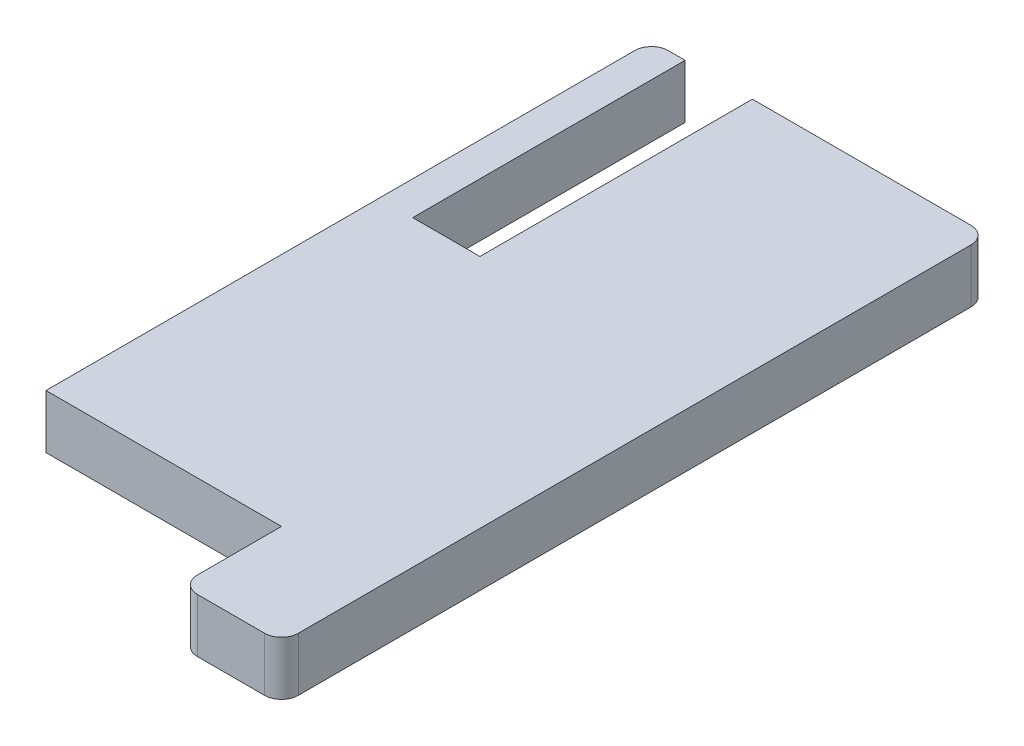
ISO-10303-21;
HEADER;
FILE_DESCRIPTION(('STEP AP214'),'2;1');
FILE_NAME('part.step','',(''),(''),'','','');
FILE_SCHEMA(('AUTOMOTIVE_DESIGN { 1 0 10303 214 1 1 1 1 }'));
ENDSEC;
DATA;
#1=APPLICATION_CONTEXT('core data for automotive mechanical design processes');
#2=APPLICATION_PROTOCOL_DEFINITION('international standard','automotive_design',2000,#1);
#3=PRODUCT_CONTEXT('',#1,'mechanical');
#4=PRODUCT('Part','Part','',(#3));
#5=PRODUCT_RELATED_PRODUCT_CATEGORY('part','',(#4));
#6=PRODUCT_DEFINITION_FORMATION('','',#4);
#7=PRODUCT_DEFINITION_CONTEXT('part definition',#1,'design');
#8=PRODUCT_DEFINITION('design','',#6,#7);
#9=PRODUCT_DEFINITION_SHAPE('','',#8);
#10=(LENGTH_UNIT() NAMED_UNIT(*) SI_UNIT(.MILLI.,.METRE.));
#11=(NAMED_UNIT(*) PLANE_ANGLE_UNIT() SI_UNIT($,.RADIAN.));
#12=(NAMED_UNIT(*) SI_UNIT($,.STERADIAN.) SOLID_ANGLE_UNIT());
#13=UNCERTAINTY_MEASURE_WITH_UNIT(LENGTH_MEASURE(1.E-05),#10,'distance_accuracy_value','');
#14=(GEOMETRIC_REPRESENTATION_CONTEXT(3) GLOBAL_UNCERTAINTY_ASSIGNED_CONTEXT((#13)) GLOBAL_UNIT_ASSIGNED_CONTEXT((#10,
#11,#12)) REPRESENTATION_CONTEXT('',''));
#15=CARTESIAN_POINT('',(0.,0.,0.));
#16=DIRECTION('',(0.,0.,1.));
#17=DIRECTION('',(1.,0.,0.));
#18=AXIS2_PLACEMENT_3D('',#15,#16,#17);
#19=CARTESIAN_POINT('',(623.012021769865,1.6,60.9484135564208));
#20=DIRECTION('',(0.,-1.,0.));
#21=DIRECTION('',(0.,0.,-1.));
#22=AXIS2_PLACEMENT_3D('',#19,#20,#21);
#23=CYLINDRICAL_SURFACE('',#22,0.500000000000028);
#24=CARTESIAN_POINT('',(623.012021769865,0.,60.9484135564208));
#25=DIRECTION('',(0.,1.,0.));
#26=DIRECTION('',(0.,0.,1.));
#27=AXIS2_PLACEMENT_3D('',#24,#25,#26);
#28=CIRCLE('',#27,0.500000000000028);
#29=CARTESIAN_POINT('',(622.512021769865,0.,60.9484135564208));
#30=VERTEX_POINT('',#29);
#31=CARTESIAN_POINT('',(623.012021769865,0.,61.4484135564208));
#32=VERTEX_POINT('',#31);
#33=EDGE_CURVE('E176',#30,#32,#28,.T.);
#34=ORIENTED_EDGE('',*,*,#33,.T.);
#35=DIRECTION('',(0.,-1.,0.));
#36=VECTOR('',#35,1.);
#37=CARTESIAN_POINT('',(623.012021769865,1.6,61.4484135564208));
#38=LINE('',#37,#36);
#39=CARTESIAN_POINT('',(623.012021769865,1.6,61.4484135564208));
#40=VERTEX_POINT('',#39);
#41=EDGE_CURVE('E11',#40,#32,#38,.T.);
#42=ORIENTED_EDGE('',*,*,#41,.F.);
#43=CARTESIAN_POINT('',(623.012021769865,1.6,60.9484135564208));
#44=DIRECTION('',(0.,1.,0.));
#45=DIRECTION('',(0.,0.,1.));
#46=AXIS2_PLACEMENT_3D('',#43,#44,#45);
#47=CIRCLE('',#46,0.500000000000028);
#48=CARTESIAN_POINT('',(622.512021769865,1.6,60.9484135564208));
#49=VERTEX_POINT('',#48);
#50=EDGE_CURVE('E218',#49,#40,#47,.T.);
#51=ORIENTED_EDGE('',*,*,#50,.F.);
#52=DIRECTION('',(0.,-1.,0.));
#53=VECTOR('',#52,1.);
#54=CARTESIAN_POINT('',(622.512021769865,1.6,60.9484135564208));
#55=LINE('',#54,#53);
#56=EDGE_CURVE('E172',#49,#30,#55,.T.);
#57=ORIENTED_EDGE('',*,*,#56,.T.);
#58=EDGE_LOOP('',(#34,#42,#51,#57));
#59=FACE_BOUND('',#58,.T.);
#60=ADVANCED_FACE('F39',(#59),#23,.T.);
#61=CARTESIAN_POINT('',(623.012021769865,1.6,61.4484135564208));
#62=DIRECTION('',(0.,0.,-1.));
#63=DIRECTION('',(-1.,0.,0.));
#64=AXIS2_PLACEMENT_3D('',#61,#62,#63);
#65=PLANE('',#64);
#66=DIRECTION('',(1.,0.,0.));
#67=VECTOR('',#66,1.);
#68=CARTESIAN_POINT('',(623.012021769865,0.,61.4484135564208));
#69=LINE('',#68,#67);
#70=CARTESIAN_POINT('',(625.012021769865,0.,61.4484135564208));
#71=VERTEX_POINT('',#70);
#72=EDGE_CURVE('E180',#32,#71,#69,.T.);
#73=ORIENTED_EDGE('',*,*,#72,.T.);
#74=DIRECTION('',(0.,-1.,0.));
#75=VECTOR('',#74,1.);
#76=CARTESIAN_POINT('',(625.012021769865,1.6,61.4484135564208));
#77=LINE('',#76,#75);
#78=CARTESIAN_POINT('',(625.012021769865,1.6,61.4484135564208));
#79=VERTEX_POINT('',#78);
#80=EDGE_CURVE('E48',#79,#71,#77,.T.);
#81=ORIENTED_EDGE('',*,*,#80,.F.);
#82=DIRECTION('',(1.,0.,0.));
#83=VECTOR('',#82,1.);
#84=CARTESIAN_POINT('',(623.012021769865,1.6,61.4484135564208));
#85=LINE('',#84,#83);
#86=EDGE_CURVE('E116',#40,#79,#85,.T.);
#87=ORIENTED_EDGE('',*,*,#86,.F.);
#88=ORIENTED_EDGE('',*,*,#41,.T.);
#89=EDGE_LOOP('',(#73,#81,#87,#88));
#90=FACE_BOUND('',#89,.T.);
#91=ADVANCED_FACE('F324',(#90),#65,.F.);
#92=CARTESIAN_POINT('',(625.012021769865,1.6,60.9484135564208));
#93=DIRECTION('',(0.,-1.,0.));
#94=DIRECTION('',(0.,0.,-1.));
#95=AXIS2_PLACEMENT_3D('',#92,#93,#94);
#96=CYLINDRICAL_SURFACE('',#95,0.499999999999973);
#97=CARTESIAN_POINT('',(625.012021769865,0.,60.9484135564208));
#98=DIRECTION('',(0.,1.,0.));
#99=DIRECTION('',(0.,0.,1.));
#100=AXIS2_PLACEMENT_3D('',#97,#98,#99);
#101=CIRCLE('',#100,0.499999999999973);
#102=CARTESIAN_POINT('',(625.512021769865,0.,60.9484135564208));
#103=VERTEX_POINT('',#102);
#104=EDGE_CURVE('E183',#71,#103,#101,.T.);
#105=ORIENTED_EDGE('',*,*,#104,.T.);
#106=DIRECTION('',(0.,-1.,0.));
#107=VECTOR('',#106,1.);
#108=CARTESIAN_POINT('',(625.512021769865,1.6,60.9484135564208));
#109=LINE('',#108,#107);
#110=CARTESIAN_POINT('',(625.512021769865,1.6,60.9484135564208));
#111=VERTEX_POINT('',#110);
#112=EDGE_CURVE('E253',#111,#103,#109,.T.);
#113=ORIENTED_EDGE('',*,*,#112,.F.);
#114=CARTESIAN_POINT('',(625.012021769865,1.6,60.9484135564208));
#115=DIRECTION('',(0.,1.,0.));
#116=DIRECTION('',(0.,0.,1.));
#117=AXIS2_PLACEMENT_3D('',#114,#115,#116);
#118=CIRCLE('',#117,0.499999999999973);
#119=EDGE_CURVE('E263',#79,#111,#118,.T.);
#120=ORIENTED_EDGE('',*,*,#119,.F.);
#121=ORIENTED_EDGE('',*,*,#80,.T.);
#122=EDGE_LOOP('',(#105,#113,#120,#121));
#123=FACE_BOUND('',#122,.T.);
#124=ADVANCED_FACE('F261',(#123),#96,.T.);
#125=CARTESIAN_POINT('',(625.512021769865,1.6,60.9484135564208));
#126=DIRECTION('',(-1.,0.,0.));
#127=DIRECTION('',(0.,0.,1.));
#128=AXIS2_PLACEMENT_3D('',#125,#126,#127);
#129=PLANE('',#128);
#130=DIRECTION('',(0.,0.,-1.));
#131=VECTOR('',#130,1.);
#132=CARTESIAN_POINT('',(625.512021769865,0.,60.9484135564208));
#133=LINE('',#132,#131);
#134=CARTESIAN_POINT('',(625.512021769865,0.,40.9484135564208));
#135=VERTEX_POINT('',#134);
#136=EDGE_CURVE('E186',#103,#135,#133,.T.);
#137=ORIENTED_EDGE('',*,*,#136,.T.);
#138=DIRECTION('',(0.,-1.,0.));
#139=VECTOR('',#138,1.);
#140=CARTESIAN_POINT('',(625.512021769865,1.6,40.9484135564208));
#141=LINE('',#140,#139);
#142=CARTESIAN_POINT('',(625.512021769865,1.6,40.9484135564208));
#143=VERTEX_POINT('',#142);
#144=EDGE_CURVE('E249',#143,#135,#141,.T.);
#145=ORIENTED_EDGE('',*,*,#144,.F.);
#146=DIRECTION('',(0.,0.,-1.));
#147=VECTOR('',#146,1.);
#148=CARTESIAN_POINT('',(625.512021769865,1.6,60.9484135564208));
#149=LINE('',#148,#147);
#150=EDGE_CURVE('E281',#111,#143,#149,.T.);
#151=ORIENTED_EDGE('',*,*,#150,.F.);
#152=ORIENTED_EDGE('',*,*,#112,.T.);
#153=EDGE_LOOP('',(#137,#145,#151,#152));
#154=FACE_BOUND('',#153,.T.);
#155=ADVANCED_FACE('F271',(#154),#129,.F.);
#156=CARTESIAN_POINT('',(625.012021769865,1.6,40.9484135564208));
#157=DIRECTION('',(0.,-1.,0.));
#158=DIRECTION('',(0.,0.,-1.));
#159=AXIS2_PLACEMENT_3D('',#156,#157,#158);
#160=CYLINDRICAL_SURFACE('',#159,0.499999999999973);
#161=CARTESIAN_POINT('',(625.012021769865,0.,40.9484135564208));
#162=DIRECTION('',(0.,1.,0.));
#163=DIRECTION('',(0.,0.,1.));
#164=AXIS2_PLACEMENT_3D('',#161,#162,#163);
#165=CIRCLE('',#164,0.499999999999973);
#166=CARTESIAN_POINT('',(625.012021769865,0.,40.4484135564208));
#167=VERTEX_POINT('',#166);
#168=EDGE_CURVE('E189',#135,#167,#165,.T.);
#169=ORIENTED_EDGE('',*,*,#168,.T.);
#170=DIRECTION('',(0.,-1.,0.));
#171=VECTOR('',#170,1.);
#172=CARTESIAN_POINT('',(625.012021769865,1.6,40.4484135564208));
#173=LINE('',#172,#171);
#174=CARTESIAN_POINT('',(625.012021769865,1.6,40.4484135564208));
#175=VERTEX_POINT('',#174);
#176=EDGE_CURVE('E245',#175,#167,#173,.T.);
#177=ORIENTED_EDGE('',*,*,#176,.F.);
#178=CARTESIAN_POINT('',(625.012021769865,1.6,40.9484135564208));
#179=DIRECTION('',(0.,1.,0.));
#180=DIRECTION('',(0.,0.,1.));
#181=AXIS2_PLACEMENT_3D('',#178,#179,#180);
#182=CIRCLE('',#181,0.499999999999973);
#183=EDGE_CURVE('E277',#143,#175,#182,.T.);
#184=ORIENTED_EDGE('',*,*,#183,.F.);
#185=ORIENTED_EDGE('',*,*,#144,.T.);
#186=EDGE_LOOP('',(#169,#177,#184,#185));
#187=FACE_BOUND('',#186,.T.);
#188=ADVANCED_FACE('F275',(#187),#160,.T.);
#189=CARTESIAN_POINT('',(618.762021769865,1.6,40.4484135564208));
#190=DIRECTION('',(0.,0.,1.));
#191=DIRECTION('',(1.,0.,0.));
#192=AXIS2_PLACEMENT_3D('',#189,#190,#191);
#193=PLANE('',#192);
#194=DIRECTION('',(-1.,0.,0.));
#195=VECTOR('',#194,1.);
#196=CARTESIAN_POINT('',(618.762021769865,0.,40.4484135564208));
#197=LINE('',#196,#195);
#198=CARTESIAN_POINT('',(618.512021769864,0.,40.4484135564208));
#199=VERTEX_POINT('',#198);
#200=EDGE_CURVE('E193',#167,#199,#197,.T.);
#201=ORIENTED_EDGE('',*,*,#200,.T.);
#202=DIRECTION('',(0.,-1.,0.));
#203=VECTOR('',#202,1.);
#204=CARTESIAN_POINT('',(618.512021769864,1.6,40.4484135564208));
#205=LINE('',#204,#203);
#206=CARTESIAN_POINT('',(618.512021769864,1.6,40.4484135564208));
#207=VERTEX_POINT('',#206);
#208=EDGE_CURVE('E241',#207,#199,#205,.T.);
#209=ORIENTED_EDGE('',*,*,#208,.F.);
#210=DIRECTION('',(-1.,0.,0.));
#211=VECTOR('',#210,1.);
#212=CARTESIAN_POINT('',(618.762021769865,1.6,40.4484135564208));
#213=LINE('',#212,#211);
#214=EDGE_CURVE('E280',#175,#207,#213,.T.);
#215=ORIENTED_EDGE('',*,*,#214,.F.);
#216=ORIENTED_EDGE('',*,*,#176,.T.);
#217=EDGE_LOOP('',(#201,#209,#215,#216));
#218=FACE_BOUND('',#217,.T.);
#219=ADVANCED_FACE('F337',(#218),#193,.F.);
#220=CARTESIAN_POINT('',(618.512021769865,1.6,48.5484135564208));
#221=DIRECTION('',(1.,0.,0.));
#222=DIRECTION('',(0.,0.,-1.));
#223=AXIS2_PLACEMENT_3D('',#220,#221,#222);
#224=PLANE('',#223);
#225=DIRECTION('',(0.,0.,1.));
#226=VECTOR('',#225,1.);
#227=CARTESIAN_POINT('',(618.512021769865,0.,48.5484135564208));
#228=LINE('',#227,#226);
#229=CARTESIAN_POINT('',(618.512021769865,0.,48.5484135564208));
#230=VERTEX_POINT('',#229);
#231=EDGE_CURVE('E196',#199,#230,#228,.T.);
#232=ORIENTED_EDGE('',*,*,#231,.T.);
#233=DIRECTION('',(0.,-1.,0.));
#234=VECTOR('',#233,1.);
#235=CARTESIAN_POINT('',(618.512021769865,1.6,48.5484135564208));
#236=LINE('',#235,#234);
#237=CARTESIAN_POINT('',(618.512021769865,1.6,48.5484135564208));
#238=VERTEX_POINT('',#237);
#239=EDGE_CURVE('E237',#238,#230,#236,.T.);
#240=ORIENTED_EDGE('',*,*,#239,.F.);
#241=DIRECTION('',(0.,0.,1.));
#242=VECTOR('',#241,1.);
#243=CARTESIAN_POINT('',(618.512021769865,1.6,48.5484135564208));
#244=LINE('',#243,#242);
#245=EDGE_CURVE('E285',#207,#238,#244,.T.);
#246=ORIENTED_EDGE('',*,*,#245,.F.);
#247=ORIENTED_EDGE('',*,*,#208,.T.);
#248=EDGE_LOOP('',(#232,#240,#246,#247));
#249=FACE_BOUND('',#248,.T.);
#250=ADVANCED_FACE('F340',(#249),#224,.F.);
#251=CARTESIAN_POINT('',(616.512021769865,1.6,48.5484135564208));
#252=DIRECTION('',(0.,0.,1.));
#253=DIRECTION('',(1.,0.,0.));
#254=AXIS2_PLACEMENT_3D('',#251,#252,#253);
#255=PLANE('',#254);
#256=DIRECTION('',(-1.,0.,0.));
#257=VECTOR('',#256,1.);
#258=CARTESIAN_POINT('',(616.512021769865,0.,48.5484135564208));
#259=LINE('',#258,#257);
#260=CARTESIAN_POINT('',(616.512021769865,0.,48.5484135564208));
#261=VERTEX_POINT('',#260);
#262=EDGE_CURVE('E199',#230,#261,#259,.T.);
#263=ORIENTED_EDGE('',*,*,#262,.T.);
#264=DIRECTION('',(0.,-1.,0.));
#265=VECTOR('',#264,1.);
#266=CARTESIAN_POINT('',(616.512021769865,1.6,48.5484135564208));
#267=LINE('',#266,#265);
#268=CARTESIAN_POINT('',(616.512021769865,1.6,48.5484135564208));
#269=VERTEX_POINT('',#268);
#270=EDGE_CURVE('E233',#269,#261,#267,.T.);
#271=ORIENTED_EDGE('',*,*,#270,.F.);
#272=DIRECTION('',(-1.,0.,0.));
#273=VECTOR('',#272,1.);
#274=CARTESIAN_POINT('',(616.512021769865,1.6,48.5484135564208));
#275=LINE('',#274,#273);
#276=EDGE_CURVE('E292',#238,#269,#275,.T.);
#277=ORIENTED_EDGE('',*,*,#276,.F.);
#278=ORIENTED_EDGE('',*,*,#239,.T.);
#279=EDGE_LOOP('',(#263,#271,#277,#278));
#280=FACE_BOUND('',#279,.T.);
#281=ADVANCED_FACE('F344',(#280),#255,.F.);
#282=CARTESIAN_POINT('',(616.512021769865,1.6,48.5484135564208));
#283=DIRECTION('',(-1.,0.,0.));
#284=DIRECTION('',(0.,0.,1.));
#285=AXIS2_PLACEMENT_3D('',#282,#283,#284);
#286=PLANE('',#285);
#287=DIRECTION('',(0.,0.,-1.));
#288=VECTOR('',#287,1.);
#289=CARTESIAN_POINT('',(616.512021769865,0.,48.5484135564208));
#290=LINE('',#289,#288);
#291=CARTESIAN_POINT('',(616.512021769865,0.,40.4484135564208));
#292=VERTEX_POINT('',#291);
#293=EDGE_CURVE('E202',#261,#292,#290,.T.);
#294=ORIENTED_EDGE('',*,*,#293,.T.);
#295=DIRECTION('',(0.,-1.,0.));
#296=VECTOR('',#295,1.);
#297=CARTESIAN_POINT('',(616.512021769865,1.6,40.4484135564208));
#298=LINE('',#297,#296);
#299=CARTESIAN_POINT('',(616.512021769865,1.6,40.4484135564208));
#300=VERTEX_POINT('',#299);
#301=EDGE_CURVE('E229',#300,#292,#298,.T.);
#302=ORIENTED_EDGE('',*,*,#301,.F.);
#303=DIRECTION('',(0.,0.,-1.));
#304=VECTOR('',#303,1.);
#305=CARTESIAN_POINT('',(616.512021769865,1.6,48.5484135564208));
#306=LINE('',#305,#304);
#307=EDGE_CURVE('E295',#269,#300,#306,.T.);
#308=ORIENTED_EDGE('',*,*,#307,.F.);
#309=ORIENTED_EDGE('',*,*,#270,.T.);
#310=EDGE_LOOP('',(#294,#302,#308,#309));
#311=FACE_BOUND('',#310,.T.);
#312=ADVANCED_FACE('F348',(#311),#286,.F.);
#313=CARTESIAN_POINT('',(616.012021769865,1.6,40.4484135564208));
#314=DIRECTION('',(0.,0.,1.));
#315=DIRECTION('',(1.,0.,0.));
#316=AXIS2_PLACEMENT_3D('',#313,#314,#315);
#317=PLANE('',#316);
#318=DIRECTION('',(-1.,0.,0.));
#319=VECTOR('',#318,1.);
#320=CARTESIAN_POINT('',(616.012021769865,0.,40.4484135564208));
#321=LINE('',#320,#319);
#322=CARTESIAN_POINT('',(616.012021769865,0.,40.4484135564208));
#323=VERTEX_POINT('',#322);
#324=EDGE_CURVE('E206',#292,#323,#321,.T.);
#325=ORIENTED_EDGE('',*,*,#324,.T.);
#326=DIRECTION('',(0.,-1.,0.));
#327=VECTOR('',#326,1.);
#328=CARTESIAN_POINT('',(616.012021769865,1.6,40.4484135564208));
#329=LINE('',#328,#327);
#330=CARTESIAN_POINT('',(616.012021769865,1.6,40.4484135564208));
#331=VERTEX_POINT('',#330);
#332=EDGE_CURVE('E225',#331,#323,#329,.T.);
#333=ORIENTED_EDGE('',*,*,#332,.F.);
#334=DIRECTION('',(-1.,0.,0.));
#335=VECTOR('',#334,1.);
#336=CARTESIAN_POINT('',(616.512021769865,1.6,40.4484135564208));
#337=LINE('',#336,#335);
#338=EDGE_CURVE('E298',#300,#331,#337,.T.);
#339=ORIENTED_EDGE('',*,*,#338,.F.);
#340=ORIENTED_EDGE('',*,*,#301,.T.);
#341=EDGE_LOOP('',(#325,#333,#339,#340));
#342=FACE_BOUND('',#341,.T.);
#343=ADVANCED_FACE('F306',(#342),#317,.F.);
#344=CARTESIAN_POINT('',(616.012021769865,1.6,40.9484135564208));
#345=DIRECTION('',(0.,-1.,0.));
#346=DIRECTION('',(0.,0.,-1.));
#347=AXIS2_PLACEMENT_3D('',#344,#345,#346);
#348=CYLINDRICAL_SURFACE('',#347,0.500000000000028);
#349=CARTESIAN_POINT('',(616.012021769865,0.,40.9484135564208));
#350=DIRECTION('',(0.,1.,0.));
#351=DIRECTION('',(0.,0.,1.));
#352=AXIS2_PLACEMENT_3D('',#349,#350,#351);
#353=CIRCLE('',#352,0.500000000000028);
#354=CARTESIAN_POINT('',(615.512021769865,0.,40.9484135564208));
#355=VERTEX_POINT('',#354);
#356=EDGE_CURVE('E209',#323,#355,#353,.T.);
#357=ORIENTED_EDGE('',*,*,#356,.T.);
#358=DIRECTION('',(0.,-1.,0.));
#359=VECTOR('',#358,1.);
#360=CARTESIAN_POINT('',(615.512021769865,1.6,40.9484135564208));
#361=LINE('',#360,#359);
#362=CARTESIAN_POINT('',(615.512021769865,1.6,40.9484135564208));
#363=VERTEX_POINT('',#362);
#364=EDGE_CURVE('E165',#363,#355,#361,.T.);
#365=ORIENTED_EDGE('',*,*,#364,.F.);
#366=CARTESIAN_POINT('',(616.012021769865,1.6,40.9484135564208));
#367=DIRECTION('',(0.,1.,0.));
#368=DIRECTION('',(0.,0.,1.));
#369=AXIS2_PLACEMENT_3D('',#366,#367,#368);
#370=CIRCLE('',#369,0.500000000000028);
#371=EDGE_CURVE('E153',#331,#363,#370,.T.);
#372=ORIENTED_EDGE('',*,*,#371,.F.);
#373=ORIENTED_EDGE('',*,*,#332,.T.);
#374=EDGE_LOOP('',(#357,#365,#372,#373));
#375=FACE_BOUND('',#374,.T.);
#376=ADVANCED_FACE('F309',(#375),#348,.T.);
#377=CARTESIAN_POINT('',(615.512021769865,1.6,58.4484135564208));
#378=DIRECTION('',(1.,0.,0.));
#379=DIRECTION('',(0.,0.,-1.));
#380=AXIS2_PLACEMENT_3D('',#377,#378,#379);
#381=PLANE('',#380);
#382=DIRECTION('',(0.,0.,1.));
#383=VECTOR('',#382,1.);
#384=CARTESIAN_POINT('',(615.512021769865,0.,58.4484135564208));
#385=LINE('',#384,#383);
#386=CARTESIAN_POINT('',(615.512021769865,0.,58.4484135564208));
#387=VERTEX_POINT('',#386);
#388=EDGE_CURVE('E163',#355,#387,#385,.T.);
#389=ORIENTED_EDGE('',*,*,#388,.T.);
#390=DIRECTION('',(0.,-1.,0.));
#391=VECTOR('',#390,1.);
#392=CARTESIAN_POINT('',(615.512021769865,1.6,58.4484135564208));
#393=LINE('',#392,#391);
#394=CARTESIAN_POINT('',(615.512021769865,1.6,58.4484135564208));
#395=VERTEX_POINT('',#394);
#396=EDGE_CURVE('E160',#395,#387,#393,.T.);
#397=ORIENTED_EDGE('',*,*,#396,.F.);
#398=DIRECTION('',(0.,0.,1.));
#399=VECTOR('',#398,1.);
#400=CARTESIAN_POINT('',(615.512021769865,1.6,58.4484135564208));
#401=LINE('',#400,#399);
#402=EDGE_CURVE('E147',#363,#395,#401,.T.);
#403=ORIENTED_EDGE('',*,*,#402,.F.);
#404=ORIENTED_EDGE('',*,*,#364,.T.);
#405=EDGE_LOOP('',(#389,#397,#403,#404));
#406=FACE_BOUND('',#405,.T.);
#407=ADVANCED_FACE('F161',(#406),#381,.F.);
#408=CARTESIAN_POINT('',(618.762021769865,1.6,58.4484135564208));
#409=DIRECTION('',(0.,0.,-1.));
#410=DIRECTION('',(-1.,0.,0.));
#411=AXIS2_PLACEMENT_3D('',#408,#409,#410);
#412=PLANE('',#411);
#413=DIRECTION('',(1.,0.,0.));
#414=VECTOR('',#413,1.);
#415=CARTESIAN_POINT('',(618.762021769865,0.,58.4484135564208));
#416=LINE('',#415,#414);
#417=CARTESIAN_POINT('',(622.512021769864,0.,58.4484135564208));
#418=VERTEX_POINT('',#417);
#419=EDGE_CURVE('E102',#387,#418,#416,.T.);
#420=ORIENTED_EDGE('',*,*,#419,.T.);
#421=DIRECTION('',(0.,-1.,0.));
#422=VECTOR('',#421,1.);
#423=CARTESIAN_POINT('',(622.512021769864,1.6,58.4484135564208));
#424=LINE('',#423,#422);
#425=CARTESIAN_POINT('',(622.512021769864,1.6,58.4484135564208));
#426=VERTEX_POINT('',#425);
#427=EDGE_CURVE('E166',#426,#418,#424,.T.);
#428=ORIENTED_EDGE('',*,*,#427,.F.);
#429=DIRECTION('',(1.,0.,0.));
#430=VECTOR('',#429,1.);
#431=CARTESIAN_POINT('',(615.512021769865,1.6,58.4484135564208));
#432=LINE('',#431,#430);
#433=EDGE_CURVE('E151',#395,#426,#432,.T.);
#434=ORIENTED_EDGE('',*,*,#433,.F.);
#435=ORIENTED_EDGE('',*,*,#396,.T.);
#436=EDGE_LOOP('',(#420,#428,#434,#435));
#437=FACE_BOUND('',#436,.T.);
#438=ADVANCED_FACE('F168',(#437),#412,.F.);
#439=CARTESIAN_POINT('',(622.512021769865,1.6,60.9484135564208));
#440=DIRECTION('',(1.,0.,0.));
#441=DIRECTION('',(0.,0.,-1.));
#442=AXIS2_PLACEMENT_3D('',#439,#440,#441);
#443=PLANE('',#442);
#444=DIRECTION('',(0.,0.,1.));
#445=VECTOR('',#444,1.);
#446=CARTESIAN_POINT('',(622.512021769865,0.,60.9484135564208));
#447=LINE('',#446,#445);
#448=EDGE_CURVE('E108',#418,#30,#447,.T.);
#449=ORIENTED_EDGE('',*,*,#448,.T.);
#450=ORIENTED_EDGE('',*,*,#56,.F.);
#451=DIRECTION('',(0.,0.,1.));
#452=VECTOR('',#451,1.);
#453=CARTESIAN_POINT('',(622.512021769865,1.6,60.9484135564208));
#454=LINE('',#453,#452);
#455=EDGE_CURVE('E56',#426,#49,#454,.T.);
#456=ORIENTED_EDGE('',*,*,#455,.F.);
#457=ORIENTED_EDGE('',*,*,#427,.T.);
#458=EDGE_LOOP('',(#449,#450,#456,#457));
#459=FACE_BOUND('',#458,.T.);
#460=ADVANCED_FACE('F313',(#459),#443,.F.);
#461=CARTESIAN_POINT('',(623.012021769865,1.6,60.9484135564208));
#462=DIRECTION('',(0.,1.,0.));
#463=DIRECTION('',(0.,0.,1.));
#464=AXIS2_PLACEMENT_3D('',#461,#462,#463);
#465=PLANE('',#464);
#466=ORIENTED_EDGE('',*,*,#50,.T.);
#467=ORIENTED_EDGE('',*,*,#86,.T.);
#468=ORIENTED_EDGE('',*,*,#119,.T.);
#469=ORIENTED_EDGE('',*,*,#150,.T.);
#470=ORIENTED_EDGE('',*,*,#183,.T.);
#471=ORIENTED_EDGE('',*,*,#214,.T.);
#472=ORIENTED_EDGE('',*,*,#245,.T.);
#473=ORIENTED_EDGE('',*,*,#276,.T.);
#474=ORIENTED_EDGE('',*,*,#307,.T.);
#475=ORIENTED_EDGE('',*,*,#338,.T.);
#476=ORIENTED_EDGE('',*,*,#371,.T.);
#477=ORIENTED_EDGE('',*,*,#402,.T.);
#478=ORIENTED_EDGE('',*,*,#433,.T.);
#479=ORIENTED_EDGE('',*,*,#455,.T.);
#480=EDGE_LOOP('',(#466,#467,#468,#469,#470,#471,#472,#473,#474,#475,#476,#477,#478,#479));
#481=FACE_BOUND('',#480,.T.);
#482=ADVANCED_FACE('F149',(#481),#465,.T.);
#483=CARTESIAN_POINT('',(623.012021769865,0.,60.9484135564208));
#484=DIRECTION('',(0.,1.,0.));
#485=DIRECTION('',(0.,0.,1.));
#486=AXIS2_PLACEMENT_3D('',#483,#484,#485);
#487=PLANE('',#486);
#488=ORIENTED_EDGE('',*,*,#33,.F.);
#489=ORIENTED_EDGE('',*,*,#448,.F.);
#490=ORIENTED_EDGE('',*,*,#419,.F.);
#491=ORIENTED_EDGE('',*,*,#388,.F.);
#492=ORIENTED_EDGE('',*,*,#356,.F.);
#493=ORIENTED_EDGE('',*,*,#324,.F.);
#494=ORIENTED_EDGE('',*,*,#293,.F.);
#495=ORIENTED_EDGE('',*,*,#262,.F.);
#496=ORIENTED_EDGE('',*,*,#231,.F.);
#497=ORIENTED_EDGE('',*,*,#200,.F.);
#498=ORIENTED_EDGE('',*,*,#168,.F.);
#499=ORIENTED_EDGE('',*,*,#136,.F.);
#500=ORIENTED_EDGE('',*,*,#104,.F.);
#501=ORIENTED_EDGE('',*,*,#72,.F.);
#502=EDGE_LOOP('',(#488,#489,#490,#491,#492,#493,#494,#495,#496,#497,#498,#499,#500,#501));
#503=FACE_BOUND('',#502,.T.);
#504=ADVANCED_FACE('F267',(#503),#487,.F.);
#505=CLOSED_SHELL('',(#60,#91,#124,#155,#188,#219,#250,#281,#312,#343,#376,#407,#438,#460,#482,#504));
#506=MANIFOLD_SOLID_BREP('B2',#505);
#507=ADVANCED_BREP_SHAPE_REPRESENTATION('',(#18,#506),#14);
#508=SHAPE_DEFINITION_REPRESENTATION(#9,#507);
ENDSEC;
END-ISO-10303-21;
